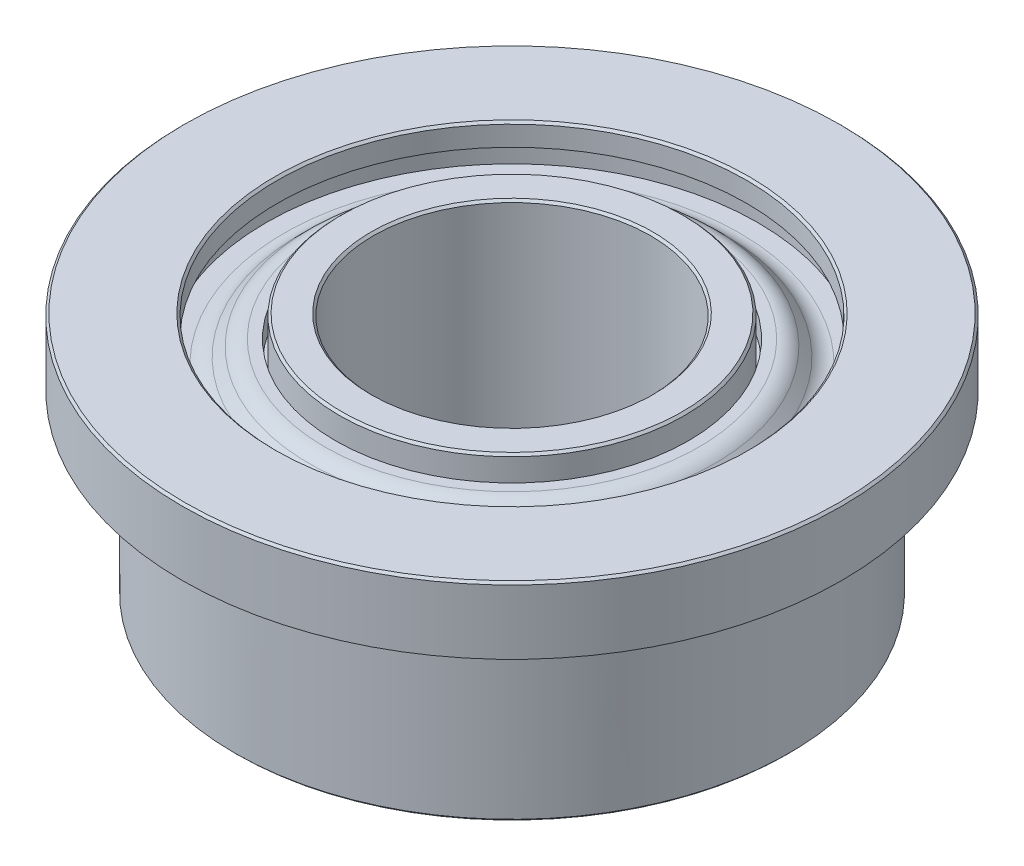
ISO-10303-21;
HEADER;
FILE_DESCRIPTION(('STEP AP214'),'2;1');
FILE_NAME('part.step','',(''),(''),'','','');
FILE_SCHEMA(('AUTOMOTIVE_DESIGN { 1 0 10303 214 1 1 1 1 }'));
ENDSEC;
DATA;
#1=APPLICATION_CONTEXT('core data for automotive mechanical design processes');
#2=APPLICATION_PROTOCOL_DEFINITION('international standard','automotive_design',2000,#1);
#3=PRODUCT_CONTEXT('',#1,'mechanical');
#4=PRODUCT('Part','Part','',(#3));
#5=PRODUCT_RELATED_PRODUCT_CATEGORY('part','',(#4));
#6=PRODUCT_DEFINITION_FORMATION('','',#4);
#7=PRODUCT_DEFINITION_CONTEXT('part definition',#1,'design');
#8=PRODUCT_DEFINITION('design','',#6,#7);
#9=PRODUCT_DEFINITION_SHAPE('','',#8);
#10=(LENGTH_UNIT() NAMED_UNIT(*) SI_UNIT(.MILLI.,.METRE.));
#11=(NAMED_UNIT(*) PLANE_ANGLE_UNIT() SI_UNIT($,.RADIAN.));
#12=(NAMED_UNIT(*) SI_UNIT($,.STERADIAN.) SOLID_ANGLE_UNIT());
#13=UNCERTAINTY_MEASURE_WITH_UNIT(LENGTH_MEASURE(1.E-05),#10,'distance_accuracy_value','');
#14=(GEOMETRIC_REPRESENTATION_CONTEXT(3) GLOBAL_UNCERTAINTY_ASSIGNED_CONTEXT((#13)) GLOBAL_UNIT_ASSIGNED_CONTEXT((#10,
#11,#12)) REPRESENTATION_CONTEXT('',''));
#15=CARTESIAN_POINT('',(0.,0.,0.));
#16=DIRECTION('',(0.,0.,1.));
#17=DIRECTION('',(1.,0.,0.));
#18=AXIS2_PLACEMENT_3D('',#15,#16,#17);
#19=CARTESIAN_POINT('',(0.,0.254,0.));
#20=DIRECTION('',(0.,-1.,0.));
#21=DIRECTION('',(0.,0.,-1.));
#22=AXIS2_PLACEMENT_3D('',#19,#20,#21);
#23=CYLINDRICAL_SURFACE('',#22,1.97485);
#24=CARTESIAN_POINT('',(0.,0.0254000000268204,0.));
#25=DIRECTION('',(0.,1.,0.));
#26=DIRECTION('',(0.,0.,1.));
#27=AXIS2_PLACEMENT_3D('',#24,#25,#26);
#28=CIRCLE('',#27,1.97485000001052);
#29=CARTESIAN_POINT('',(0.,0.0254000000268206,1.97485000001052));
#30=VERTEX_POINT('',#29);
#31=EDGE_CURVE('E325',#30,#30,#28,.F.);
#32=ORIENTED_EDGE('',*,*,#31,.F.);
#33=EDGE_LOOP('',(#32));
#34=FACE_BOUND('',#33,.T.);
#35=CARTESIAN_POINT('',(0.,0.508,0.));
#36=DIRECTION('',(0.,-1.,0.));
#37=DIRECTION('',(0.,0.,-1.));
#38=AXIS2_PLACEMENT_3D('',#35,#36,#37);
#39=CIRCLE('',#38,1.97485);
#40=CARTESIAN_POINT('',(0.,0.508,-1.97485));
#41=VERTEX_POINT('',#40);
#42=EDGE_CURVE('E322',#41,#41,#39,.F.);
#43=ORIENTED_EDGE('',*,*,#42,.F.);
#44=EDGE_LOOP('',(#43));
#45=FACE_BOUND('',#44,.T.);
#46=ADVANCED_FACE('F17',(#34,#45),#23,.T.);
#47=CARTESIAN_POINT('',(0.,0.0253999999131338,0.));
#48=DIRECTION('',(0.,1.,0.));
#49=DIRECTION('',(0.,0.,1.));
#50=AXIS2_PLACEMENT_3D('',#47,#48,#49);
#51=CONICAL_SURFACE('',#50,1.97484999989683,0.785398163397448);
#52=CARTESIAN_POINT('',(0.,0.,0.));
#53=DIRECTION('',(0.,1.,0.));
#54=DIRECTION('',(0.,0.,1.));
#55=AXIS2_PLACEMENT_3D('',#52,#53,#54);
#56=CIRCLE('',#55,1.9494499999837);
#57=CARTESIAN_POINT('',(0.,0.,1.9494499999837));
#58=VERTEX_POINT('',#57);
#59=EDGE_CURVE('E320',#58,#58,#56,.T.);
#60=ORIENTED_EDGE('',*,*,#59,.T.);
#61=EDGE_LOOP('',(#60));
#62=FACE_BOUND('',#61,.T.);
#63=ORIENTED_EDGE('',*,*,#31,.T.);
#64=EDGE_LOOP('',(#63));
#65=FACE_BOUND('',#64,.T.);
#66=ADVANCED_FACE('F125',(#62,#65),#51,.T.);
#67=CARTESIAN_POINT('',(0.,0.508,0.));
#68=DIRECTION('',(0.,-1.,0.));
#69=DIRECTION('',(0.,0.,-1.));
#70=AXIS2_PLACEMENT_3D('',#67,#68,#69);
#71=PLANE('',#70);
#72=ORIENTED_EDGE('',*,*,#42,.T.);
#73=EDGE_LOOP('',(#72));
#74=FACE_BOUND('',#73,.T.);
#75=CARTESIAN_POINT('',(0.,0.508,0.));
#76=DIRECTION('',(0.,-1.,0.));
#77=DIRECTION('',(0.,0.,-1.));
#78=AXIS2_PLACEMENT_3D('',#75,#76,#77);
#79=CIRCLE('',#78,2.01896623057775);
#80=CARTESIAN_POINT('',(0.,0.508,-2.01896623057775));
#81=VERTEX_POINT('',#80);
#82=EDGE_CURVE('E317',#81,#81,#79,.T.);
#83=ORIENTED_EDGE('',*,*,#82,.T.);
#84=EDGE_LOOP('',(#83));
#85=FACE_BOUND('',#84,.T.);
#86=ADVANCED_FACE('F122',(#74,#85),#71,.T.);
#87=CARTESIAN_POINT('',(0.,0.,0.));
#88=DIRECTION('',(0.,1.,0.));
#89=DIRECTION('',(0.,0.,1.));
#90=AXIS2_PLACEMENT_3D('',#87,#88,#89);
#91=PLANE('',#90);
#92=ORIENTED_EDGE('',*,*,#59,.F.);
#93=EDGE_LOOP('',(#92));
#94=FACE_BOUND('',#93,.T.);
#95=CARTESIAN_POINT('',(0.,0.,0.));
#96=DIRECTION('',(0.,-1.,0.));
#97=DIRECTION('',(0.,0.,-1.));
#98=AXIS2_PLACEMENT_3D('',#95,#96,#97);
#99=CIRCLE('',#98,1.61289999999781);
#100=CARTESIAN_POINT('',(0.,0.,-1.61289999999781));
#101=VERTEX_POINT('',#100);
#102=EDGE_CURVE('E314',#101,#101,#99,.F.);
#103=ORIENTED_EDGE('',*,*,#102,.T.);
#104=EDGE_LOOP('',(#103));
#105=FACE_BOUND('',#104,.T.);
#106=ADVANCED_FACE('F118',(#94,#105),#91,.F.);
#107=CARTESIAN_POINT('',(0.,0.508,0.));
#108=DIRECTION('',(0.,-1.,0.));
#109=DIRECTION('',(0.,0.,-1.));
#110=AXIS2_PLACEMENT_3D('',#107,#108,#109);
#111=CYLINDRICAL_SURFACE('',#110,2.01896623057775);
#112=ORIENTED_EDGE('',*,*,#82,.F.);
#113=EDGE_LOOP('',(#112));
#114=FACE_BOUND('',#113,.T.);
#115=CARTESIAN_POINT('',(0.,0.254,0.));
#116=DIRECTION('',(0.,-1.,0.));
#117=DIRECTION('',(0.,0.,-1.));
#118=AXIS2_PLACEMENT_3D('',#115,#116,#117);
#119=CIRCLE('',#118,2.01896623057775);
#120=CARTESIAN_POINT('',(0.,0.254,-2.01896623057775));
#121=VERTEX_POINT('',#120);
#122=EDGE_CURVE('E311',#121,#121,#119,.F.);
#123=ORIENTED_EDGE('',*,*,#122,.F.);
#124=EDGE_LOOP('',(#123));
#125=FACE_BOUND('',#124,.T.);
#126=ADVANCED_FACE('F114',(#114,#125),#111,.F.);
#127=CARTESIAN_POINT('',(0.,5.6843418860808E-11,0.));
#128=DIRECTION('',(0.,-1.,0.));
#129=DIRECTION('',(0.,0.,-1.));
#130=AXIS2_PLACEMENT_3D('',#127,#128,#129);
#131=CONICAL_SURFACE('',#130,1.61289999994096,0.785398163397448);
#132=CARTESIAN_POINT('',(0.,0.0254000000000009,0.));
#133=DIRECTION('',(0.,1.,0.));
#134=DIRECTION('',(0.,0.,1.));
#135=AXIS2_PLACEMENT_3D('',#132,#133,#134);
#136=CIRCLE('',#135,1.5875);
#137=CARTESIAN_POINT('',(0.,0.0254000000000009,1.5875));
#138=VERTEX_POINT('',#137);
#139=EDGE_CURVE('E64',#138,#138,#136,.T.);
#140=ORIENTED_EDGE('',*,*,#139,.T.);
#141=EDGE_LOOP('',(#140));
#142=FACE_BOUND('',#141,.T.);
#143=ORIENTED_EDGE('',*,*,#102,.F.);
#144=EDGE_LOOP('',(#143));
#145=FACE_BOUND('',#144,.T.);
#146=ADVANCED_FACE('F109',(#142,#145),#131,.F.);
#147=CARTESIAN_POINT('',(0.,0.254,0.));
#148=DIRECTION('',(0.,-1.,0.));
#149=DIRECTION('',(0.,0.,-1.));
#150=AXIS2_PLACEMENT_3D('',#147,#148,#149);
#151=PLANE('',#150);
#152=ORIENTED_EDGE('',*,*,#122,.T.);
#153=EDGE_LOOP('',(#152));
#154=FACE_BOUND('',#153,.T.);
#155=CARTESIAN_POINT('',(0.,0.254,0.));
#156=DIRECTION('',(0.,1.,0.));
#157=DIRECTION('',(0.,0.,1.));
#158=AXIS2_PLACEMENT_3D('',#155,#156,#157);
#159=CIRCLE('',#158,2.14126095179241);
#160=CARTESIAN_POINT('',(0.,0.254,2.14126095179241));
#161=VERTEX_POINT('',#160);
#162=CARTESIAN_POINT('',(0.,0.254,-2.14126095179241));
#163=VERTEX_POINT('',#162);
#164=EDGE_CURVE('E62',#161,#163,#159,.T.);
#165=ORIENTED_EDGE('',*,*,#164,.F.);
#166=CARTESIAN_POINT('',(0.,0.254,0.));
#167=DIRECTION('',(0.,1.,0.));
#168=DIRECTION('',(0.,0.,-1.));
#169=AXIS2_PLACEMENT_3D('',#166,#167,#168);
#170=CIRCLE('',#169,2.14126095179241);
#171=EDGE_CURVE('E57',#163,#161,#170,.T.);
#172=ORIENTED_EDGE('',*,*,#171,.F.);
#173=EDGE_LOOP('',(#165,#172));
#174=FACE_BOUND('',#173,.T.);
#175=ADVANCED_FACE('F61',(#154,#174),#151,.T.);
#176=CARTESIAN_POINT('',(0.,0.,0.));
#177=DIRECTION('',(0.,1.,0.));
#178=DIRECTION('',(0.,0.,1.));
#179=AXIS2_PLACEMENT_3D('',#176,#177,#178);
#180=CYLINDRICAL_SURFACE('',#179,1.5875);
#181=ORIENTED_EDGE('',*,*,#139,.F.);
#182=EDGE_LOOP('',(#181));
#183=FACE_BOUND('',#182,.T.);
#184=CARTESIAN_POINT('',(0.,2.76860000002443,0.));
#185=DIRECTION('',(0.,1.,0.));
#186=DIRECTION('',(0.,0.,1.));
#187=AXIS2_PLACEMENT_3D('',#184,#185,#186);
#188=CIRCLE('',#187,1.58750000002783);
#189=CARTESIAN_POINT('',(0.,2.76860000002443,1.58750000002783));
#190=VERTEX_POINT('',#189);
#191=EDGE_CURVE('E70',#190,#190,#188,.T.);
#192=ORIENTED_EDGE('',*,*,#191,.T.);
#193=EDGE_LOOP('',(#192));
#194=FACE_BOUND('',#193,.T.);
#195=ADVANCED_FACE('F90',(#183,#194),#180,.F.);
#196=CARTESIAN_POINT('',(0.,0.508,0.));
#197=DIRECTION('',(0.,-1.,0.));
#198=DIRECTION('',(0.,0.,-1.));
#199=AXIS2_PLACEMENT_3D('',#196,#197,#198);
#200=TOROIDAL_SURFACE('',#199,2.14126095179241,0.254);
#201=ORIENTED_EDGE('',*,*,#171,.T.);
#202=ORIENTED_EDGE('',*,*,#164,.T.);
#203=EDGE_LOOP('',(#201,#202));
#204=FACE_BOUND('',#203,.T.);
#205=CARTESIAN_POINT('',(0.,0.328394877612936,0.));
#206=DIRECTION('',(0.,1.,0.));
#207=DIRECTION('',(0.,0.,1.));
#208=AXIS2_PLACEMENT_3D('',#205,#206,#207);
#209=CIRCLE('',#208,2.32086607417159);
#210=CARTESIAN_POINT('',(0.,0.328394877612936,2.32086607417159));
#211=VERTEX_POINT('',#210);
#212=EDGE_CURVE('E96',#211,#211,#209,.T.);
#213=ORIENTED_EDGE('',*,*,#212,.F.);
#214=EDGE_LOOP('',(#213));
#215=FACE_BOUND('',#214,.T.);
#216=ADVANCED_FACE('F68',(#204,#215),#200,.T.);
#217=CARTESIAN_POINT('',(0.,2.79399999993757,0.));
#218=DIRECTION('',(0.,1.,0.));
#219=DIRECTION('',(0.,0.,1.));
#220=AXIS2_PLACEMENT_3D('',#217,#218,#219);
#221=CONICAL_SURFACE('',#220,1.61289999999781,0.785398164516413);
#222=ORIENTED_EDGE('',*,*,#191,.F.);
#223=EDGE_LOOP('',(#222));
#224=FACE_BOUND('',#223,.T.);
#225=CARTESIAN_POINT('',(0.,2.79399999993757,0.));
#226=DIRECTION('',(0.,1.,0.));
#227=DIRECTION('',(0.,0.,1.));
#228=AXIS2_PLACEMENT_3D('',#225,#226,#227);
#229=CIRCLE('',#228,1.61289999999781);
#230=CARTESIAN_POINT('',(0.,2.79399999993757,1.61289999999781));
#231=VERTEX_POINT('',#230);
#232=EDGE_CURVE('E299',#231,#231,#229,.F.);
#233=ORIENTED_EDGE('',*,*,#232,.F.);
#234=EDGE_LOOP('',(#233));
#235=FACE_BOUND('',#234,.T.);
#236=ADVANCED_FACE('F89',(#224,#235),#221,.F.);
#237=CARTESIAN_POINT('',(0.,0.433605122339031,0.));
#238=DIRECTION('',(0.,1.,0.));
#239=DIRECTION('',(-1.,0.,0.));
#240=AXIS2_PLACEMENT_3D('',#237,#238,#239);
#241=CONICAL_SURFACE('',#240,2.42607631895453,0.785398163397448);
#242=CARTESIAN_POINT('',(0.,0.433605122421383,0.));
#243=DIRECTION('',(0.,-1.,0.));
#244=DIRECTION('',(0.,0.,-1.));
#245=AXIS2_PLACEMENT_3D('',#242,#243,#244);
#246=CIRCLE('',#245,2.42607631905656);
#247=CARTESIAN_POINT('',(0.,0.433605122421383,-2.42607631905656));
#248=VERTEX_POINT('',#247);
#249=EDGE_CURVE('E291',#248,#248,#246,.T.);
#250=ORIENTED_EDGE('',*,*,#249,.T.);
#251=EDGE_LOOP('',(#250));
#252=FACE_BOUND('',#251,.T.);
#253=ORIENTED_EDGE('',*,*,#212,.T.);
#254=EDGE_LOOP('',(#253));
#255=FACE_BOUND('',#254,.T.);
#256=ADVANCED_FACE('F630',(#252,#255),#241,.T.);
#257=CARTESIAN_POINT('',(0.,2.794,0.));
#258=DIRECTION('',(0.,1.,0.));
#259=DIRECTION('',(0.,0.,1.));
#260=AXIS2_PLACEMENT_3D('',#257,#258,#259);
#261=PLANE('',#260);
#262=CARTESIAN_POINT('',(0.,2.79400000005126,0.));
#263=DIRECTION('',(0.,-1.,0.));
#264=DIRECTION('',(0.,0.,-1.));
#265=AXIS2_PLACEMENT_3D('',#262,#263,#264);
#266=CIRCLE('',#265,1.94944999992686);
#267=CARTESIAN_POINT('',(0.,2.79400000005126,-1.94944999992686));
#268=VERTEX_POINT('',#267);
#269=EDGE_CURVE('E298',#268,#268,#266,.T.);
#270=ORIENTED_EDGE('',*,*,#269,.F.);
#271=EDGE_LOOP('',(#270));
#272=FACE_BOUND('',#271,.T.);
#273=ORIENTED_EDGE('',*,*,#232,.T.);
#274=EDGE_LOOP('',(#273));
#275=FACE_BOUND('',#274,.T.);
#276=ADVANCED_FACE('F278',(#272,#275),#261,.T.);
#277=CARTESIAN_POINT('',(0.,0.254,0.));
#278=DIRECTION('',(0.,-1.,0.));
#279=DIRECTION('',(0.,0.,-1.));
#280=AXIS2_PLACEMENT_3D('',#277,#278,#279);
#281=TOROIDAL_SURFACE('',#280,2.60568144147795,0.254);
#282=ORIENTED_EDGE('',*,*,#249,.F.);
#283=EDGE_LOOP('',(#282));
#284=FACE_BOUND('',#283,.T.);
#285=CARTESIAN_POINT('',(0.,0.508,0.));
#286=DIRECTION('',(0.,-1.,0.));
#287=DIRECTION('',(0.,0.,1.));
#288=AXIS2_PLACEMENT_3D('',#285,#286,#287);
#289=CIRCLE('',#288,2.60568144147795);
#290=CARTESIAN_POINT('',(0.,0.508,-2.60568144147795));
#291=VERTEX_POINT('',#290);
#292=CARTESIAN_POINT('',(0.,0.508,2.60568144147795));
#293=VERTEX_POINT('',#292);
#294=EDGE_CURVE('E261',#291,#293,#289,.F.);
#295=ORIENTED_EDGE('',*,*,#294,.F.);
#296=CARTESIAN_POINT('',(0.,0.508,0.));
#297=DIRECTION('',(0.,-1.,0.));
#298=DIRECTION('',(0.,0.,-1.));
#299=AXIS2_PLACEMENT_3D('',#296,#297,#298);
#300=CIRCLE('',#299,2.60568144147795);
#301=EDGE_CURVE('E288',#293,#291,#300,.F.);
#302=ORIENTED_EDGE('',*,*,#301,.F.);
#303=EDGE_LOOP('',(#295,#302));
#304=FACE_BOUND('',#303,.T.);
#305=ADVANCED_FACE('F266',(#284,#304),#281,.F.);
#306=CARTESIAN_POINT('',(0.,2.76860000008128,0.));
#307=DIRECTION('',(0.,-1.,0.));
#308=DIRECTION('',(0.,0.,-1.));
#309=AXIS2_PLACEMENT_3D('',#306,#307,#308);
#310=CONICAL_SURFACE('',#309,1.97484999989683,0.785398163397448);
#311=ORIENTED_EDGE('',*,*,#269,.T.);
#312=EDGE_LOOP('',(#311));
#313=FACE_BOUND('',#312,.T.);
#314=CARTESIAN_POINT('',(0.,2.7686,0.));
#315=DIRECTION('',(0.,1.,0.));
#316=DIRECTION('',(0.,0.,1.));
#317=AXIS2_PLACEMENT_3D('',#314,#315,#316);
#318=CIRCLE('',#317,1.97485);
#319=CARTESIAN_POINT('',(0.,2.7686,1.97485));
#320=VERTEX_POINT('',#319);
#321=EDGE_CURVE('E286',#320,#320,#318,.F.);
#322=ORIENTED_EDGE('',*,*,#321,.F.);
#323=EDGE_LOOP('',(#322));
#324=FACE_BOUND('',#323,.T.);
#325=ADVANCED_FACE('F277',(#313,#324),#310,.T.);
#326=CARTESIAN_POINT('',(0.,0.508,0.));
#327=DIRECTION('',(0.,-1.,0.));
#328=DIRECTION('',(0.,0.,-1.));
#329=AXIS2_PLACEMENT_3D('',#326,#327,#328);
#330=PLANE('',#329);
#331=CARTESIAN_POINT('',(0.,0.508,0.));
#332=DIRECTION('',(0.,-1.,0.));
#333=DIRECTION('',(0.,0.,-1.));
#334=AXIS2_PLACEMENT_3D('',#331,#332,#333);
#335=CIRCLE('',#334,2.81305);
#336=CARTESIAN_POINT('',(0.,0.508,-2.81305));
#337=VERTEX_POINT('',#336);
#338=EDGE_CURVE('E383',#337,#337,#335,.T.);
#339=ORIENTED_EDGE('',*,*,#338,.T.);
#340=EDGE_LOOP('',(#339));
#341=FACE_BOUND('',#340,.T.);
#342=ORIENTED_EDGE('',*,*,#294,.T.);
#343=ORIENTED_EDGE('',*,*,#301,.T.);
#344=EDGE_LOOP('',(#342,#343));
#345=FACE_BOUND('',#344,.T.);
#346=ADVANCED_FACE('F393',(#341,#345),#330,.T.);
#347=CARTESIAN_POINT('',(0.,2.54,0.));
#348=DIRECTION('',(0.,1.,0.));
#349=DIRECTION('',(0.,0.,1.));
#350=AXIS2_PLACEMENT_3D('',#347,#348,#349);
#351=CYLINDRICAL_SURFACE('',#350,1.97485);
#352=CARTESIAN_POINT('',(0.,2.286,0.));
#353=DIRECTION('',(0.,1.,0.));
#354=DIRECTION('',(0.,0.,1.));
#355=AXIS2_PLACEMENT_3D('',#352,#353,#354);
#356=CIRCLE('',#355,1.97485);
#357=CARTESIAN_POINT('',(0.,2.286,1.97485));
#358=VERTEX_POINT('',#357);
#359=EDGE_CURVE('E381',#358,#358,#356,.F.);
#360=ORIENTED_EDGE('',*,*,#359,.F.);
#361=EDGE_LOOP('',(#360));
#362=FACE_BOUND('',#361,.T.);
#363=ORIENTED_EDGE('',*,*,#321,.T.);
#364=EDGE_LOOP('',(#363));
#365=FACE_BOUND('',#364,.T.);
#366=ADVANCED_FACE('F405',(#362,#365),#351,.T.);
#367=CARTESIAN_POINT('',(0.,0.508,0.));
#368=DIRECTION('',(0.,-1.,0.));
#369=DIRECTION('',(0.,0.,-1.));
#370=AXIS2_PLACEMENT_3D('',#367,#368,#369);
#371=CYLINDRICAL_SURFACE('',#370,2.81305);
#372=CARTESIAN_POINT('',(0.,0.254,0.));
#373=DIRECTION('',(0.,-1.,0.));
#374=DIRECTION('',(0.,0.,-1.));
#375=AXIS2_PLACEMENT_3D('',#372,#373,#374);
#376=CIRCLE('',#375,2.81305);
#377=CARTESIAN_POINT('',(0.,0.254,-2.81305));
#378=VERTEX_POINT('',#377);
#379=EDGE_CURVE('E378',#378,#378,#376,.T.);
#380=ORIENTED_EDGE('',*,*,#379,.T.);
#381=EDGE_LOOP('',(#380));
#382=FACE_BOUND('',#381,.T.);
#383=ORIENTED_EDGE('',*,*,#338,.F.);
#384=EDGE_LOOP('',(#383));
#385=FACE_BOUND('',#384,.T.);
#386=ADVANCED_FACE('F416',(#382,#385),#371,.F.);
#387=CARTESIAN_POINT('',(0.,2.286,0.));
#388=DIRECTION('',(0.,1.,0.));
#389=DIRECTION('',(0.,0.,1.));
#390=AXIS2_PLACEMENT_3D('',#387,#388,#389);
#391=PLANE('',#390);
#392=CARTESIAN_POINT('',(0.,2.286,0.));
#393=DIRECTION('',(0.,1.,0.));
#394=DIRECTION('',(0.,0.,1.));
#395=AXIS2_PLACEMENT_3D('',#392,#393,#394);
#396=CIRCLE('',#395,2.01896623057775);
#397=CARTESIAN_POINT('',(0.,2.286,2.01896623057775));
#398=VERTEX_POINT('',#397);
#399=EDGE_CURVE('E375',#398,#398,#396,.T.);
#400=ORIENTED_EDGE('',*,*,#399,.T.);
#401=EDGE_LOOP('',(#400));
#402=FACE_BOUND('',#401,.T.);
#403=ORIENTED_EDGE('',*,*,#359,.T.);
#404=EDGE_LOOP('',(#403));
#405=FACE_BOUND('',#404,.T.);
#406=ADVANCED_FACE('F420',(#402,#405),#391,.T.);
#407=CARTESIAN_POINT('',(0.,0.254,0.));
#408=DIRECTION('',(0.,-1.,0.));
#409=DIRECTION('',(0.,0.,-1.));
#410=AXIS2_PLACEMENT_3D('',#407,#408,#409);
#411=PLANE('',#410);
#412=CARTESIAN_POINT('',(0.,0.254,0.));
#413=DIRECTION('',(0.,-1.,0.));
#414=DIRECTION('',(0.,0.,-1.));
#415=AXIS2_PLACEMENT_3D('',#412,#413,#414);
#416=CIRCLE('',#415,2.68605);
#417=CARTESIAN_POINT('',(0.,0.254,-2.68605));
#418=VERTEX_POINT('',#417);
#419=EDGE_CURVE('E372',#418,#418,#416,.T.);
#420=ORIENTED_EDGE('',*,*,#419,.T.);
#421=EDGE_LOOP('',(#420));
#422=FACE_BOUND('',#421,.T.);
#423=ORIENTED_EDGE('',*,*,#379,.F.);
#424=EDGE_LOOP('',(#423));
#425=FACE_BOUND('',#424,.T.);
#426=ADVANCED_FACE('F424',(#422,#425),#411,.F.);
#427=CARTESIAN_POINT('',(0.,2.286,0.));
#428=DIRECTION('',(0.,1.,0.));
#429=DIRECTION('',(0.,0.,1.));
#430=AXIS2_PLACEMENT_3D('',#427,#428,#429);
#431=CYLINDRICAL_SURFACE('',#430,2.01896623057775);
#432=CARTESIAN_POINT('',(0.,2.54,0.));
#433=DIRECTION('',(0.,1.,0.));
#434=DIRECTION('',(0.,0.,1.));
#435=AXIS2_PLACEMENT_3D('',#432,#433,#434);
#436=CIRCLE('',#435,2.01896623057775);
#437=CARTESIAN_POINT('',(0.,2.54,2.01896623057775));
#438=VERTEX_POINT('',#437);
#439=EDGE_CURVE('E368',#438,#438,#436,.F.);
#440=ORIENTED_EDGE('',*,*,#439,.F.);
#441=EDGE_LOOP('',(#440));
#442=FACE_BOUND('',#441,.T.);
#443=ORIENTED_EDGE('',*,*,#399,.F.);
#444=EDGE_LOOP('',(#443));
#445=FACE_BOUND('',#444,.T.);
#446=ADVANCED_FACE('F428',(#442,#445),#431,.F.);
#447=CARTESIAN_POINT('',(0.,0.254,0.));
#448=DIRECTION('',(0.,-1.,0.));
#449=DIRECTION('',(0.,0.,-1.));
#450=AXIS2_PLACEMENT_3D('',#447,#448,#449);
#451=CYLINDRICAL_SURFACE('',#450,2.68605);
#452=CARTESIAN_POINT('',(0.,0.0254000000268206,0.));
#453=DIRECTION('',(0.,-1.,0.));
#454=DIRECTION('',(0.,0.,-1.));
#455=AXIS2_PLACEMENT_3D('',#452,#453,#454);
#456=CIRCLE('',#455,2.68605000002253);
#457=CARTESIAN_POINT('',(0.,0.0254000000268206,-2.68605000002253));
#458=VERTEX_POINT('',#457);
#459=EDGE_CURVE('E371',#458,#458,#456,.T.);
#460=ORIENTED_EDGE('',*,*,#459,.T.);
#461=EDGE_LOOP('',(#460));
#462=FACE_BOUND('',#461,.T.);
#463=ORIENTED_EDGE('',*,*,#419,.F.);
#464=EDGE_LOOP('',(#463));
#465=FACE_BOUND('',#464,.T.);
#466=ADVANCED_FACE('F432',(#462,#465),#451,.F.);
#467=CARTESIAN_POINT('',(0.,2.54,0.));
#468=DIRECTION('',(0.,1.,0.));
#469=DIRECTION('',(0.,0.,1.));
#470=AXIS2_PLACEMENT_3D('',#467,#468,#469);
#471=PLANE('',#470);
#472=CARTESIAN_POINT('',(0.,2.54,0.));
#473=DIRECTION('',(0.,-1.,0.));
#474=DIRECTION('',(0.,0.,-1.));
#475=AXIS2_PLACEMENT_3D('',#472,#473,#474);
#476=CIRCLE('',#475,2.14126095179242);
#477=CARTESIAN_POINT('',(0.,2.54,-2.14126095179242));
#478=VERTEX_POINT('',#477);
#479=CARTESIAN_POINT('',(0.,2.54,2.14126095179242));
#480=VERTEX_POINT('',#479);
#481=EDGE_CURVE('E362',#478,#480,#476,.T.);
#482=ORIENTED_EDGE('',*,*,#481,.F.);
#483=CARTESIAN_POINT('',(0.,2.54,0.));
#484=DIRECTION('',(0.,-1.,0.));
#485=DIRECTION('',(0.,0.,1.));
#486=AXIS2_PLACEMENT_3D('',#483,#484,#485);
#487=CIRCLE('',#486,2.14126095179242);
#488=EDGE_CURVE('E365',#480,#478,#487,.T.);
#489=ORIENTED_EDGE('',*,*,#488,.F.);
#490=EDGE_LOOP('',(#482,#489));
#491=FACE_BOUND('',#490,.T.);
#492=ORIENTED_EDGE('',*,*,#439,.T.);
#493=EDGE_LOOP('',(#492));
#494=FACE_BOUND('',#493,.T.);
#495=ADVANCED_FACE('F435',(#491,#494),#471,.T.);
#496=CARTESIAN_POINT('',(0.,0.,0.));
#497=DIRECTION('',(0.,-1.,0.));
#498=DIRECTION('',(0.,0.,-1.));
#499=AXIS2_PLACEMENT_3D('',#496,#497,#498);
#500=CONICAL_SURFACE('',#499,2.71145000004935,0.785398163397448);
#501=CARTESIAN_POINT('',(0.,0.,0.));
#502=DIRECTION('',(0.,-1.,0.));
#503=DIRECTION('',(0.,0.,-1.));
#504=AXIS2_PLACEMENT_3D('',#501,#502,#503);
#505=CIRCLE('',#504,2.71145000004935);
#506=CARTESIAN_POINT('',(0.,0.,-2.71145000004935));
#507=VERTEX_POINT('',#506);
#508=EDGE_CURVE('E225',#507,#507,#505,.T.);
#509=ORIENTED_EDGE('',*,*,#508,.T.);
#510=EDGE_LOOP('',(#509));
#511=FACE_BOUND('',#510,.T.);
#512=ORIENTED_EDGE('',*,*,#459,.F.);
#513=EDGE_LOOP('',(#512));
#514=FACE_BOUND('',#513,.T.);
#515=ADVANCED_FACE('F237',(#511,#514),#500,.F.);
#516=CARTESIAN_POINT('',(0.,2.286,0.));
#517=DIRECTION('',(0.,1.,0.));
#518=DIRECTION('',(0.,0.,1.));
#519=AXIS2_PLACEMENT_3D('',#516,#517,#518);
#520=TOROIDAL_SURFACE('',#519,2.14126095179242,0.254);
#521=ORIENTED_EDGE('',*,*,#488,.T.);
#522=ORIENTED_EDGE('',*,*,#481,.T.);
#523=EDGE_LOOP('',(#521,#522));
#524=FACE_BOUND('',#523,.T.);
#525=CARTESIAN_POINT('',(0.,2.46560512238148,0.));
#526=DIRECTION('',(0.,-1.,0.));
#527=DIRECTION('',(0.,0.,-1.));
#528=AXIS2_PLACEMENT_3D('',#525,#526,#527);
#529=CIRCLE('',#528,2.32086607422843);
#530=CARTESIAN_POINT('',(0.,2.46560512238148,-2.32086607422843));
#531=VERTEX_POINT('',#530);
#532=EDGE_CURVE('E222',#531,#531,#529,.T.);
#533=ORIENTED_EDGE('',*,*,#532,.F.);
#534=EDGE_LOOP('',(#533));
#535=FACE_BOUND('',#534,.T.);
#536=ADVANCED_FACE('F231',(#524,#535),#520,.T.);
#537=CARTESIAN_POINT('',(0.,0.,0.));
#538=DIRECTION('',(0.,1.,0.));
#539=DIRECTION('',(0.,0.,1.));
#540=AXIS2_PLACEMENT_3D('',#537,#538,#539);
#541=PLANE('',#540);
#542=CARTESIAN_POINT('',(0.,0.,0.));
#543=DIRECTION('',(0.,1.,0.));
#544=DIRECTION('',(0.,0.,1.));
#545=AXIS2_PLACEMENT_3D('',#542,#543,#544);
#546=CIRCLE('',#545,3.149599999972);
#547=CARTESIAN_POINT('',(0.,0.,3.149599999972));
#548=VERTEX_POINT('',#547);
#549=EDGE_CURVE('E216',#548,#548,#546,.T.);
#550=ORIENTED_EDGE('',*,*,#549,.F.);
#551=EDGE_LOOP('',(#550));
#552=FACE_BOUND('',#551,.T.);
#553=ORIENTED_EDGE('',*,*,#508,.F.);
#554=EDGE_LOOP('',(#553));
#555=FACE_BOUND('',#554,.T.);
#556=ADVANCED_FACE('F236',(#552,#555),#541,.F.);
#557=CARTESIAN_POINT('',(0.,2.36039487754169,0.));
#558=DIRECTION('',(0.,-1.,0.));
#559=DIRECTION('',(0.,0.,-1.));
#560=AXIS2_PLACEMENT_3D('',#557,#558,#559);
#561=CONICAL_SURFACE('',#560,2.42607631906822,0.785398163397448);
#562=CARTESIAN_POINT('',(0.,2.36039487757862,0.));
#563=DIRECTION('',(0.,1.,0.));
#564=DIRECTION('',(0.,0.,1.));
#565=AXIS2_PLACEMENT_3D('',#562,#563,#564);
#566=CIRCLE('',#565,2.42607631905657);
#567=CARTESIAN_POINT('',(0.,2.36039487757862,2.42607631905657));
#568=VERTEX_POINT('',#567);
#569=EDGE_CURVE('E211',#568,#568,#566,.T.);
#570=ORIENTED_EDGE('',*,*,#569,.T.);
#571=EDGE_LOOP('',(#570));
#572=FACE_BOUND('',#571,.T.);
#573=ORIENTED_EDGE('',*,*,#532,.T.);
#574=EDGE_LOOP('',(#573));
#575=FACE_BOUND('',#574,.T.);
#576=ADVANCED_FACE('F342',(#572,#575),#561,.T.);
#577=CARTESIAN_POINT('',(0.,0.0253999999699772,0.));
#578=DIRECTION('',(0.,1.,0.));
#579=DIRECTION('',(0.,0.,1.));
#580=AXIS2_PLACEMENT_3D('',#577,#578,#579);
#581=CONICAL_SURFACE('',#580,3.17499999999882,0.785398164516413);
#582=CARTESIAN_POINT('',(0.,0.0254000000000009,0.));
#583=DIRECTION('',(0.,-1.,0.));
#584=DIRECTION('',(0.,0.,-1.));
#585=AXIS2_PLACEMENT_3D('',#582,#583,#584);
#586=CIRCLE('',#585,3.175);
#587=CARTESIAN_POINT('',(0.,0.0254000000000009,-3.175));
#588=VERTEX_POINT('',#587);
#589=EDGE_CURVE('E209',#588,#588,#586,.F.);
#590=ORIENTED_EDGE('',*,*,#589,.F.);
#591=EDGE_LOOP('',(#590));
#592=FACE_BOUND('',#591,.T.);
#593=ORIENTED_EDGE('',*,*,#549,.T.);
#594=EDGE_LOOP('',(#593));
#595=FACE_BOUND('',#594,.T.);
#596=ADVANCED_FACE('F337',(#592,#595),#581,.T.);
#597=CARTESIAN_POINT('',(0.,2.54,0.));
#598=DIRECTION('',(0.,1.,0.));
#599=DIRECTION('',(0.,0.,1.));
#600=AXIS2_PLACEMENT_3D('',#597,#598,#599);
#601=TOROIDAL_SURFACE('',#600,2.60568144147795,0.254);
#602=ORIENTED_EDGE('',*,*,#569,.F.);
#603=EDGE_LOOP('',(#602));
#604=FACE_BOUND('',#603,.T.);
#605=CARTESIAN_POINT('',(0.,2.286,0.));
#606=DIRECTION('',(0.,1.,0.));
#607=DIRECTION('',(0.,0.,-1.));
#608=AXIS2_PLACEMENT_3D('',#605,#606,#607);
#609=CIRCLE('',#608,2.60568144147795);
#610=CARTESIAN_POINT('',(0.,2.286,2.60568144147795));
#611=VERTEX_POINT('',#610);
#612=CARTESIAN_POINT('',(0.,2.286,-2.60568144147795));
#613=VERTEX_POINT('',#612);
#614=EDGE_CURVE('E204',#611,#613,#609,.F.);
#615=ORIENTED_EDGE('',*,*,#614,.F.);
#616=CARTESIAN_POINT('',(0.,2.286,0.));
#617=DIRECTION('',(0.,1.,0.));
#618=DIRECTION('',(0.,0.,1.));
#619=AXIS2_PLACEMENT_3D('',#616,#617,#618);
#620=CIRCLE('',#619,2.60568144147795);
#621=EDGE_CURVE('E36',#613,#611,#620,.F.);
#622=ORIENTED_EDGE('',*,*,#621,.F.);
#623=EDGE_LOOP('',(#615,#622));
#624=FACE_BOUND('',#623,.T.);
#625=ADVANCED_FACE('F328',(#604,#624),#601,.F.);
#626=CARTESIAN_POINT('',(0.,2.032,0.));
#627=DIRECTION('',(0.,-1.,0.));
#628=DIRECTION('',(0.,0.,-1.));
#629=AXIS2_PLACEMENT_3D('',#626,#627,#628);
#630=CYLINDRICAL_SURFACE('',#629,3.175);
#631=ORIENTED_EDGE('',*,*,#589,.T.);
#632=EDGE_LOOP('',(#631));
#633=FACE_BOUND('',#632,.T.);
#634=CARTESIAN_POINT('',(0.,1.7272,0.));
#635=DIRECTION('',(0.,-1.,0.));
#636=DIRECTION('',(0.,0.,-1.));
#637=AXIS2_PLACEMENT_3D('',#634,#635,#636);
#638=CIRCLE('',#637,3.175);
#639=CARTESIAN_POINT('',(0.,1.7272,-3.175));
#640=VERTEX_POINT('',#639);
#641=EDGE_CURVE('E205',#640,#640,#638,.F.);
#642=ORIENTED_EDGE('',*,*,#641,.F.);
#643=EDGE_LOOP('',(#642));
#644=FACE_BOUND('',#643,.T.);
#645=ADVANCED_FACE('F184',(#633,#644),#630,.T.);
#646=CARTESIAN_POINT('',(0.,2.286,0.));
#647=DIRECTION('',(0.,1.,0.));
#648=DIRECTION('',(0.,0.,1.));
#649=AXIS2_PLACEMENT_3D('',#646,#647,#648);
#650=PLANE('',#649);
#651=ORIENTED_EDGE('',*,*,#614,.T.);
#652=ORIENTED_EDGE('',*,*,#621,.T.);
#653=EDGE_LOOP('',(#651,#652));
#654=FACE_BOUND('',#653,.T.);
#655=CARTESIAN_POINT('',(0.,2.286,0.));
#656=DIRECTION('',(0.,1.,0.));
#657=DIRECTION('',(0.,0.,1.));
#658=AXIS2_PLACEMENT_3D('',#655,#656,#657);
#659=CIRCLE('',#658,2.81305);
#660=CARTESIAN_POINT('',(0.,2.286,2.81305));
#661=VERTEX_POINT('',#660);
#662=EDGE_CURVE('E207',#661,#661,#659,.T.);
#663=ORIENTED_EDGE('',*,*,#662,.T.);
#664=EDGE_LOOP('',(#663));
#665=FACE_BOUND('',#664,.T.);
#666=ADVANCED_FACE('F179',(#654,#665),#650,.T.);
#667=CARTESIAN_POINT('',(3.175,1.7272,0.));
#668=DIRECTION('',(0.,1.,0.));
#669=DIRECTION('',(0.,0.,1.));
#670=AXIS2_PLACEMENT_3D('',#667,#668,#669);
#671=PLANE('',#670);
#672=CARTESIAN_POINT('',(0.,1.7272,0.));
#673=DIRECTION('',(0.,1.,0.));
#674=DIRECTION('',(0.,0.,1.));
#675=AXIS2_PLACEMENT_3D('',#672,#673,#674);
#676=CIRCLE('',#675,3.0734);
#677=CARTESIAN_POINT('',(0.,1.7272,3.0734));
#678=VERTEX_POINT('',#677);
#679=EDGE_CURVE('E745',#678,#678,#676,.T.);
#680=ORIENTED_EDGE('',*,*,#679,.F.);
#681=EDGE_LOOP('',(#680));
#682=FACE_BOUND('',#681,.T.);
#683=ORIENTED_EDGE('',*,*,#641,.T.);
#684=EDGE_LOOP('',(#683));
#685=FACE_BOUND('',#684,.T.);
#686=ADVANCED_FACE('F175',(#682,#685),#671,.T.);
#687=CARTESIAN_POINT('',(0.,2.286,0.));
#688=DIRECTION('',(0.,1.,0.));
#689=DIRECTION('',(0.,0.,1.));
#690=AXIS2_PLACEMENT_3D('',#687,#688,#689);
#691=CYLINDRICAL_SURFACE('',#690,2.81305);
#692=ORIENTED_EDGE('',*,*,#662,.F.);
#693=EDGE_LOOP('',(#692));
#694=FACE_BOUND('',#693,.T.);
#695=CARTESIAN_POINT('',(0.,2.54,0.));
#696=DIRECTION('',(0.,1.,0.));
#697=DIRECTION('',(0.,0.,1.));
#698=AXIS2_PLACEMENT_3D('',#695,#696,#697);
#699=CIRCLE('',#698,2.81305);
#700=CARTESIAN_POINT('',(0.,2.54,2.81305));
#701=VERTEX_POINT('',#700);
#702=EDGE_CURVE('E748',#701,#701,#699,.T.);
#703=ORIENTED_EDGE('',*,*,#702,.T.);
#704=EDGE_LOOP('',(#703));
#705=FACE_BOUND('',#704,.T.);
#706=ADVANCED_FACE('F171',(#694,#705),#691,.F.);
#707=CARTESIAN_POINT('',(0.,0.,0.));
#708=DIRECTION('',(0.,1.,0.));
#709=DIRECTION('',(0.,0.,1.));
#710=AXIS2_PLACEMENT_3D('',#707,#708,#709);
#711=CYLINDRICAL_SURFACE('',#710,3.0734);
#712=CARTESIAN_POINT('',(0.,2.032,0.));
#713=DIRECTION('',(0.,1.,0.));
#714=DIRECTION('',(0.,0.,1.));
#715=AXIS2_PLACEMENT_3D('',#712,#713,#714);
#716=CIRCLE('',#715,3.0734);
#717=CARTESIAN_POINT('',(0.,2.032,3.0734));
#718=VERTEX_POINT('',#717);
#719=EDGE_CURVE('E751',#718,#718,#716,.F.);
#720=ORIENTED_EDGE('',*,*,#719,.T.);
#721=EDGE_LOOP('',(#720));
#722=FACE_BOUND('',#721,.T.);
#723=ORIENTED_EDGE('',*,*,#679,.T.);
#724=EDGE_LOOP('',(#723));
#725=FACE_BOUND('',#724,.T.);
#726=ADVANCED_FACE('F167',(#722,#725),#711,.T.);
#727=CARTESIAN_POINT('',(0.,2.54,0.));
#728=DIRECTION('',(0.,1.,0.));
#729=DIRECTION('',(0.,0.,1.));
#730=AXIS2_PLACEMENT_3D('',#727,#728,#729);
#731=PLANE('',#730);
#732=CARTESIAN_POINT('',(0.,2.54,0.));
#733=DIRECTION('',(0.,1.,0.));
#734=DIRECTION('',(0.,0.,1.));
#735=AXIS2_PLACEMENT_3D('',#732,#733,#734);
#736=CIRCLE('',#735,2.68605);
#737=CARTESIAN_POINT('',(0.,2.54,2.68605));
#738=VERTEX_POINT('',#737);
#739=EDGE_CURVE('E754',#738,#738,#736,.T.);
#740=ORIENTED_EDGE('',*,*,#739,.T.);
#741=EDGE_LOOP('',(#740));
#742=FACE_BOUND('',#741,.T.);
#743=ORIENTED_EDGE('',*,*,#702,.F.);
#744=EDGE_LOOP('',(#743));
#745=FACE_BOUND('',#744,.T.);
#746=ADVANCED_FACE('F163',(#742,#745),#731,.F.);
#747=CARTESIAN_POINT('',(0.,2.032,0.));
#748=DIRECTION('',(0.,1.,0.));
#749=DIRECTION('',(0.,0.,1.));
#750=AXIS2_PLACEMENT_3D('',#747,#748,#749);
#751=PLANE('',#750);
#752=ORIENTED_EDGE('',*,*,#719,.F.);
#753=EDGE_LOOP('',(#752));
#754=FACE_BOUND('',#753,.T.);
#755=CARTESIAN_POINT('',(0.,2.032,0.));
#756=DIRECTION('',(0.,-1.,0.));
#757=DIRECTION('',(0.,0.,-1.));
#758=AXIS2_PLACEMENT_3D('',#755,#756,#757);
#759=CIRCLE('',#758,3.7719);
#760=CARTESIAN_POINT('',(0.,2.032,-3.7719));
#761=VERTEX_POINT('',#760);
#762=EDGE_CURVE('E757',#761,#761,#759,.F.);
#763=ORIENTED_EDGE('',*,*,#762,.F.);
#764=EDGE_LOOP('',(#763));
#765=FACE_BOUND('',#764,.T.);
#766=ADVANCED_FACE('F159',(#754,#765),#751,.F.);
#767=CARTESIAN_POINT('',(0.,2.54,0.));
#768=DIRECTION('',(0.,1.,0.));
#769=DIRECTION('',(0.,0.,1.));
#770=AXIS2_PLACEMENT_3D('',#767,#768,#769);
#771=CYLINDRICAL_SURFACE('',#770,2.68605);
#772=ORIENTED_EDGE('',*,*,#739,.F.);
#773=EDGE_LOOP('',(#772));
#774=FACE_BOUND('',#773,.T.);
#775=CARTESIAN_POINT('',(0.,2.76859999996759,0.));
#776=DIRECTION('',(0.,1.,0.));
#777=DIRECTION('',(0.,0.,1.));
#778=AXIS2_PLACEMENT_3D('',#775,#776,#777);
#779=CIRCLE('',#778,2.68604999996569);
#780=CARTESIAN_POINT('',(0.,2.76859999996759,2.68604999996569));
#781=VERTEX_POINT('',#780);
#782=EDGE_CURVE('E760',#781,#781,#779,.T.);
#783=ORIENTED_EDGE('',*,*,#782,.T.);
#784=EDGE_LOOP('',(#783));
#785=FACE_BOUND('',#784,.T.);
#786=ADVANCED_FACE('F155',(#774,#785),#771,.F.);
#787=CARTESIAN_POINT('',(0.,2.794,0.));
#788=DIRECTION('',(0.,-1.,0.));
#789=DIRECTION('',(0.,0.,-1.));
#790=AXIS2_PLACEMENT_3D('',#787,#788,#789);
#791=CYLINDRICAL_SURFACE('',#790,3.7719);
#792=ORIENTED_EDGE('',*,*,#762,.T.);
#793=EDGE_LOOP('',(#792));
#794=FACE_BOUND('',#793,.T.);
#795=CARTESIAN_POINT('',(0.,2.76860000002443,0.));
#796=DIRECTION('',(0.,-1.,0.));
#797=DIRECTION('',(0.,0.,-1.));
#798=AXIS2_PLACEMENT_3D('',#795,#796,#797);
#799=CIRCLE('',#798,3.77189999994698);
#800=CARTESIAN_POINT('',(0.,2.76860000002443,-3.77189999994698));
#801=VERTEX_POINT('',#800);
#802=EDGE_CURVE('E762',#801,#801,#799,.F.);
#803=ORIENTED_EDGE('',*,*,#802,.F.);
#804=EDGE_LOOP('',(#803));
#805=FACE_BOUND('',#804,.T.);
#806=ADVANCED_FACE('F151',(#794,#805),#791,.T.);
#807=CARTESIAN_POINT('',(0.,2.79399999993757,0.));
#808=DIRECTION('',(0.,1.,0.));
#809=DIRECTION('',(0.,0.,1.));
#810=AXIS2_PLACEMENT_3D('',#807,#808,#809);
#811=CONICAL_SURFACE('',#810,2.71144999993567,0.785398163397448);
#812=ORIENTED_EDGE('',*,*,#782,.F.);
#813=EDGE_LOOP('',(#812));
#814=FACE_BOUND('',#813,.T.);
#815=CARTESIAN_POINT('',(0.,2.79399999999441,0.));
#816=DIRECTION('',(0.,1.,0.));
#817=DIRECTION('',(0.,0.,1.));
#818=AXIS2_PLACEMENT_3D('',#815,#816,#817);
#819=CIRCLE('',#818,2.71144999999251);
#820=CARTESIAN_POINT('',(0.,2.79399999999441,2.71144999999251));
#821=VERTEX_POINT('',#820);
#822=EDGE_CURVE('E28',#821,#821,#819,.F.);
#823=ORIENTED_EDGE('',*,*,#822,.F.);
#824=EDGE_LOOP('',(#823));
#825=FACE_BOUND('',#824,.T.);
#826=ADVANCED_FACE('F144',(#814,#825),#811,.F.);
#827=CARTESIAN_POINT('',(0.,2.76860000008128,0.));
#828=DIRECTION('',(0.,-1.,0.));
#829=DIRECTION('',(0.,0.,-1.));
#830=AXIS2_PLACEMENT_3D('',#827,#828,#829);
#831=CONICAL_SURFACE('',#830,3.77189999989014,0.785398163397448);
#832=ORIENTED_EDGE('',*,*,#802,.T.);
#833=EDGE_LOOP('',(#832));
#834=FACE_BOUND('',#833,.T.);
#835=CARTESIAN_POINT('',(0.,2.79399999993757,0.));
#836=DIRECTION('',(0.,-1.,0.));
#837=DIRECTION('',(0.,0.,-1.));
#838=AXIS2_PLACEMENT_3D('',#835,#836,#837);
#839=CIRCLE('',#838,3.74650000003385);
#840=CARTESIAN_POINT('',(0.,2.79399999993757,-3.74650000003385));
#841=VERTEX_POINT('',#840);
#842=EDGE_CURVE('E11',#841,#841,#839,.F.);
#843=ORIENTED_EDGE('',*,*,#842,.F.);
#844=EDGE_LOOP('',(#843));
#845=FACE_BOUND('',#844,.T.);
#846=ADVANCED_FACE('F138',(#834,#845),#831,.T.);
#847=CARTESIAN_POINT('',(0.,2.794,0.));
#848=DIRECTION('',(0.,1.,0.));
#849=DIRECTION('',(0.,0.,1.));
#850=AXIS2_PLACEMENT_3D('',#847,#848,#849);
#851=PLANE('',#850);
#852=ORIENTED_EDGE('',*,*,#842,.T.);
#853=EDGE_LOOP('',(#852));
#854=FACE_BOUND('',#853,.T.);
#855=ORIENTED_EDGE('',*,*,#822,.T.);
#856=EDGE_LOOP('',(#855));
#857=FACE_BOUND('',#856,.T.);
#858=ADVANCED_FACE('F136',(#854,#857),#851,.T.);
#859=CLOSED_SHELL('',(#46,#66,#86,#106,#126,#146,#175,#195,#216,#236,#256,#276,#305,#325,#346,
#366,#386,#406,#426,#446,#466,#495,#515,#536,#556,#576,#596,#625,#645,#666,#686,#706,#726,#746,
#766,#786,#806,#826,#846,#858));
#860=MANIFOLD_SOLID_BREP('B1',#859);
#861=ADVANCED_BREP_SHAPE_REPRESENTATION('',(#18,#860),#14);
#862=SHAPE_DEFINITION_REPRESENTATION(#9,#861);
ENDSEC;
END-ISO-10303-21;
